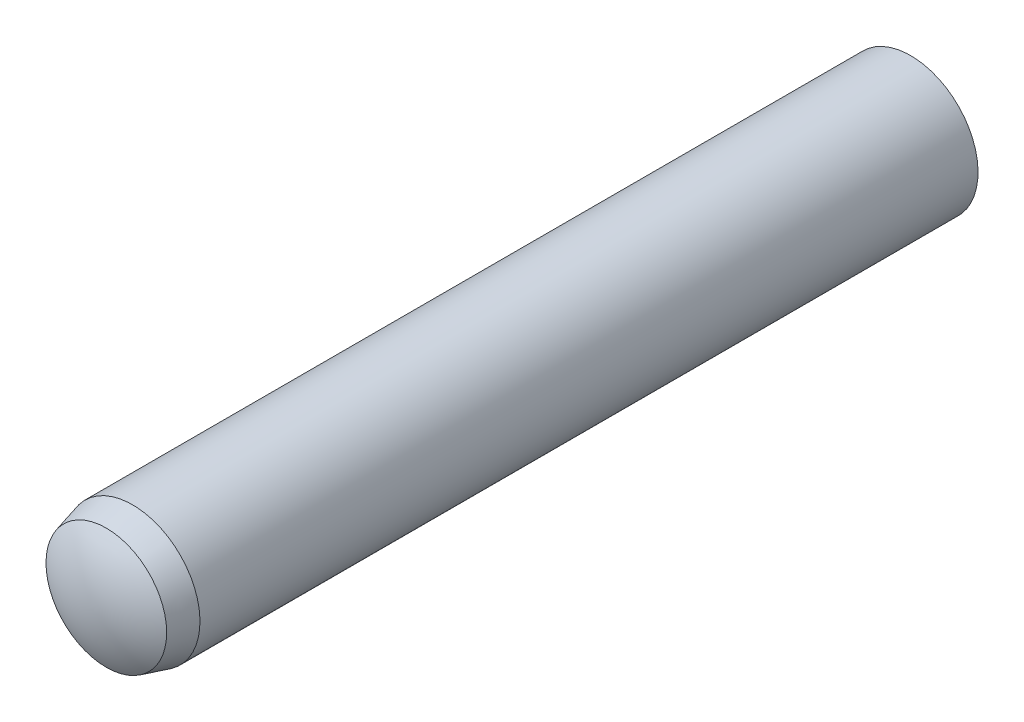
ISO-10303-21;
HEADER;
FILE_DESCRIPTION(('STEP AP214'),'2;1');
FILE_NAME('part.step','',(''),(''),'','','');
FILE_SCHEMA(('AUTOMOTIVE_DESIGN { 1 0 10303 214 1 1 1 1 }'));
ENDSEC;
DATA;
#1=APPLICATION_CONTEXT('core data for automotive mechanical design processes');
#2=APPLICATION_PROTOCOL_DEFINITION('international standard','automotive_design',2000,#1);
#3=PRODUCT_CONTEXT('',#1,'mechanical');
#4=PRODUCT('Part','Part','',(#3));
#5=PRODUCT_RELATED_PRODUCT_CATEGORY('part','',(#4));
#6=PRODUCT_DEFINITION_FORMATION('','',#4);
#7=PRODUCT_DEFINITION_CONTEXT('part definition',#1,'design');
#8=PRODUCT_DEFINITION('design','',#6,#7);
#9=PRODUCT_DEFINITION_SHAPE('','',#8);
#10=(LENGTH_UNIT() NAMED_UNIT(*) SI_UNIT(.MILLI.,.METRE.));
#11=(NAMED_UNIT(*) PLANE_ANGLE_UNIT() SI_UNIT($,.RADIAN.));
#12=(NAMED_UNIT(*) SI_UNIT($,.STERADIAN.) SOLID_ANGLE_UNIT());
#13=UNCERTAINTY_MEASURE_WITH_UNIT(LENGTH_MEASURE(1.E-05),#10,'distance_accuracy_value','');
#14=(GEOMETRIC_REPRESENTATION_CONTEXT(3) GLOBAL_UNCERTAINTY_ASSIGNED_CONTEXT((#13)) GLOBAL_UNIT_ASSIGNED_CONTEXT((#10,
#11,#12)) REPRESENTATION_CONTEXT('',''));
#15=CARTESIAN_POINT('',(0.,0.,0.));
#16=DIRECTION('',(0.,0.,1.));
#17=DIRECTION('',(1.,0.,0.));
#18=AXIS2_PLACEMENT_3D('',#15,#16,#17);
#19=CARTESIAN_POINT('',(0.,0.,-17.7333333333334));
#20=DIRECTION('',(0.,0.,1.));
#21=DIRECTION('',(0.,-1.,0.));
#22=AXIS2_PLACEMENT_3D('',#19,#20,#21);
#23=SPHERICAL_SURFACE('',#22,7.26666666666665);
#24=CARTESIAN_POINT('',(0.,0.,-23.8));
#25=DIRECTION('',(0.,0.,1.));
#26=DIRECTION('',(0.,-1.,0.));
#27=AXIS2_PLACEMENT_3D('',#24,#25,#26);
#28=CIRCLE('',#27,3.99999999999999);
#29=CARTESIAN_POINT('',(0.,-3.99999999999999,-23.8));
#30=VERTEX_POINT('',#29);
#31=EDGE_CURVE('E10',#30,#30,#28,.T.);
#32=ORIENTED_EDGE('',*,*,#31,.F.);
#33=EDGE_LOOP('',(#32));
#34=FACE_BOUND('',#33,.T.);
#35=ADVANCED_FACE('F41',(#34),#23,.T.);
#36=CARTESIAN_POINT('',(0.,0.,25.));
#37=DIRECTION('',(0.,0.,1.));
#38=DIRECTION('',(0.,-1.,0.));
#39=AXIS2_PLACEMENT_3D('',#36,#37,#38);
#40=CYLINDRICAL_SURFACE('',#39,4.);
#41=CARTESIAN_POINT('',(0.,0.,22.4));
#42=DIRECTION('',(0.,0.,1.));
#43=DIRECTION('',(0.,-1.,0.));
#44=AXIS2_PLACEMENT_3D('',#41,#42,#43);
#45=CIRCLE('',#44,4.);
#46=CARTESIAN_POINT('',(0.,-4.,22.4));
#47=VERTEX_POINT('',#46);
#48=EDGE_CURVE('E48',#47,#47,#45,.T.);
#49=ORIENTED_EDGE('',*,*,#48,.F.);
#50=EDGE_LOOP('',(#49));
#51=FACE_BOUND('',#50,.T.);
#52=ORIENTED_EDGE('',*,*,#31,.T.);
#53=EDGE_LOOP('',(#52));
#54=FACE_BOUND('',#53,.T.);
#55=ADVANCED_FACE('F65',(#51,#54),#40,.T.);
#56=CARTESIAN_POINT('',(0.,0.,22.4));
#57=DIRECTION('',(0.,0.,-1.));
#58=DIRECTION('',(0.,1.,0.));
#59=AXIS2_PLACEMENT_3D('',#56,#57,#58);
#60=CONICAL_SURFACE('',#59,4.,0.261799387799149);
#61=CARTESIAN_POINT('',(0.,0.,23.96));
#62=DIRECTION('',(0.,0.,1.));
#63=DIRECTION('',(0.,-1.,0.));
#64=AXIS2_PLACEMENT_3D('',#61,#62,#63);
#65=CIRCLE('',#64,3.58199925980745);
#66=CARTESIAN_POINT('',(0.,-3.58199925980745,23.96));
#67=VERTEX_POINT('',#66);
#68=EDGE_CURVE('E54',#67,#67,#65,.T.);
#69=ORIENTED_EDGE('',*,*,#68,.F.);
#70=EDGE_LOOP('',(#69));
#71=FACE_BOUND('',#70,.T.);
#72=ORIENTED_EDGE('',*,*,#48,.T.);
#73=EDGE_LOOP('',(#72));
#74=FACE_BOUND('',#73,.T.);
#75=ADVANCED_FACE('F63',(#71,#74),#60,.T.);
#76=CARTESIAN_POINT('',(0.,0.,18.3113852417014));
#77=DIRECTION('',(0.,0.,1.));
#78=DIRECTION('',(0.,1.,0.));
#79=AXIS2_PLACEMENT_3D('',#76,#77,#78);
#80=SPHERICAL_SURFACE('',#79,6.68861475829861);
#81=ORIENTED_EDGE('',*,*,#68,.T.);
#82=EDGE_LOOP('',(#81));
#83=FACE_BOUND('',#82,.T.);
#84=ADVANCED_FACE('F61',(#83),#80,.T.);
#85=CLOSED_SHELL('',(#35,#55,#75,#84));
#86=MANIFOLD_SOLID_BREP('B2',#85);
#87=ADVANCED_BREP_SHAPE_REPRESENTATION('',(#18,#86),#14);
#88=SHAPE_DEFINITION_REPRESENTATION(#9,#87);
ENDSEC;
END-ISO-10303-21;
